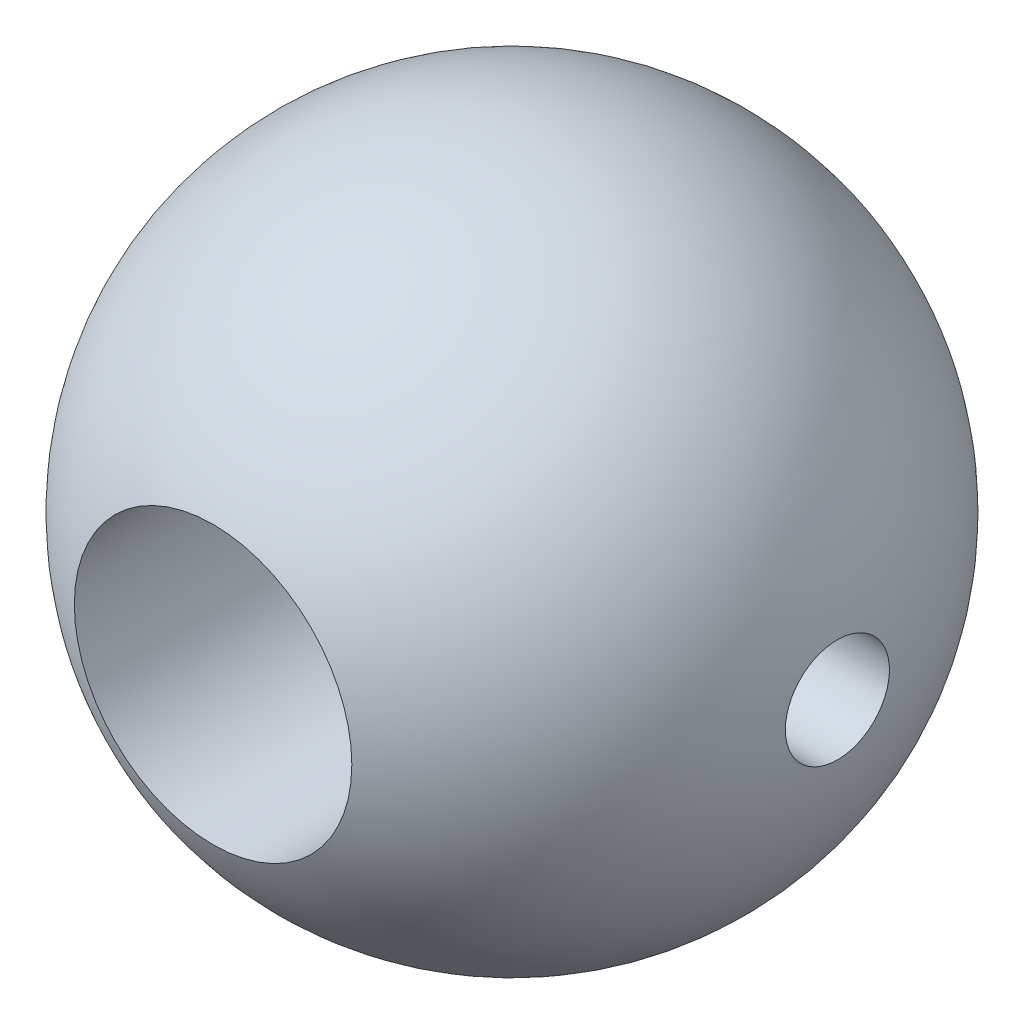
ISO-10303-21;
HEADER;
FILE_DESCRIPTION(('STEP AP214'),'2;1');
FILE_NAME('part.step','',(''),(''),'','','');
FILE_SCHEMA(('AUTOMOTIVE_DESIGN { 1 0 10303 214 1 1 1 1 }'));
ENDSEC;
DATA;
#1=APPLICATION_CONTEXT('core data for automotive mechanical design processes');
#2=APPLICATION_PROTOCOL_DEFINITION('international standard','automotive_design',2000,#1);
#3=PRODUCT_CONTEXT('',#1,'mechanical');
#4=PRODUCT('Part','Part','',(#3));
#5=PRODUCT_RELATED_PRODUCT_CATEGORY('part','',(#4));
#6=PRODUCT_DEFINITION_FORMATION('','',#4);
#7=PRODUCT_DEFINITION_CONTEXT('part definition',#1,'design');
#8=PRODUCT_DEFINITION('design','',#6,#7);
#9=PRODUCT_DEFINITION_SHAPE('','',#8);
#10=(LENGTH_UNIT() NAMED_UNIT(*) SI_UNIT(.MILLI.,.METRE.));
#11=(NAMED_UNIT(*) PLANE_ANGLE_UNIT() SI_UNIT($,.RADIAN.));
#12=(NAMED_UNIT(*) SI_UNIT($,.STERADIAN.) SOLID_ANGLE_UNIT());
#13=UNCERTAINTY_MEASURE_WITH_UNIT(LENGTH_MEASURE(1.E-05),#10,'distance_accuracy_value','');
#14=(GEOMETRIC_REPRESENTATION_CONTEXT(3) GLOBAL_UNCERTAINTY_ASSIGNED_CONTEXT((#13)) GLOBAL_UNIT_ASSIGNED_CONTEXT((#10,
#11,#12)) REPRESENTATION_CONTEXT('',''));
#15=CARTESIAN_POINT('',(0.,0.,0.));
#16=DIRECTION('',(0.,0.,1.));
#17=DIRECTION('',(1.,0.,0.));
#18=AXIS2_PLACEMENT_3D('',#15,#16,#17);
#19=CARTESIAN_POINT('',(0.,0.,0.));
#20=DIRECTION('',(0.,0.,-1.));
#21=DIRECTION('',(1.,0.,0.));
#22=AXIS2_PLACEMENT_3D('',#19,#20,#21);
#23=SPHERICAL_SURFACE('',#22,9.652);
#24=CARTESIAN_POINT('',(0.,0.,-8.75471347332396));
#25=DIRECTION('',(0.,0.,-1.));
#26=DIRECTION('',(-1.,0.,0.));
#27=AXIS2_PLACEMENT_3D('',#24,#25,#26);
#28=CIRCLE('',#27,4.064);
#29=CARTESIAN_POINT('',(-4.06399999999999,0.,-8.75471347332396));
#30=VERTEX_POINT('',#29);
#31=EDGE_CURVE('E55',#30,#30,#28,.T.);
#32=ORIENTED_EDGE('',*,*,#31,.F.);
#33=EDGE_LOOP('',(#32));
#34=FACE_BOUND('',#33,.T.);
#35=CARTESIAN_POINT('',(0.,0.,8.75471347332396));
#36=DIRECTION('',(0.,0.,-1.));
#37=DIRECTION('',(-1.,0.,0.));
#38=AXIS2_PLACEMENT_3D('',#35,#36,#37);
#39=CIRCLE('',#38,4.064);
#40=CARTESIAN_POINT('',(-4.06399999999999,0.,8.75471347332396));
#41=VERTEX_POINT('',#40);
#42=EDGE_CURVE('E10',#41,#41,#39,.T.);
#43=ORIENTED_EDGE('',*,*,#42,.T.);
#44=EDGE_LOOP('',(#43));
#45=FACE_BOUND('',#44,.T.);
#46=CARTESIAN_POINT('',(9.53092482396121,0.,0.));
#47=DIRECTION('',(-1.,0.,0.));
#48=DIRECTION('',(0.,0.,1.));
#49=AXIS2_PLACEMENT_3D('',#46,#47,#48);
#50=CIRCLE('',#49,1.524);
#51=CARTESIAN_POINT('',(9.53092482396121,0.,1.524));
#52=VERTEX_POINT('',#51);
#53=EDGE_CURVE('E95',#52,#52,#50,.F.);
#54=ORIENTED_EDGE('',*,*,#53,.F.);
#55=EDGE_LOOP('',(#54));
#56=FACE_BOUND('',#55,.T.);
#57=CARTESIAN_POINT('',(-9.53092482396121,0.,0.));
#58=DIRECTION('',(1.,0.,0.));
#59=DIRECTION('',(0.,0.,-1.));
#60=AXIS2_PLACEMENT_3D('',#57,#58,#59);
#61=CIRCLE('',#60,1.524);
#62=CARTESIAN_POINT('',(-9.53092482396121,0.,-1.524));
#63=VERTEX_POINT('',#62);
#64=EDGE_CURVE('E61',#63,#63,#61,.F.);
#65=ORIENTED_EDGE('',*,*,#64,.F.);
#66=EDGE_LOOP('',(#65));
#67=FACE_BOUND('',#66,.T.);
#68=ADVANCED_FACE('F43',(#34,#45,#56,#67),#23,.T.);
#69=CARTESIAN_POINT('',(0.,0.,0.));
#70=DIRECTION('',(0.,0.,-1.));
#71=DIRECTION('',(-1.,0.,0.));
#72=AXIS2_PLACEMENT_3D('',#69,#70,#71);
#73=CYLINDRICAL_SURFACE('',#72,4.064);
#74=ORIENTED_EDGE('',*,*,#42,.F.);
#75=EDGE_LOOP('',(#74));
#76=FACE_BOUND('',#75,.T.);
#77=ORIENTED_EDGE('',*,*,#31,.T.);
#78=EDGE_LOOP('',(#77));
#79=FACE_BOUND('',#78,.T.);
#80=CARTESIAN_POINT('',(4.064,0.,1.524));
#81=CARTESIAN_POINT('',(4.0640022093545,0.0825348198808585,1.52400294873996));
#82=CARTESIAN_POINT('',(4.06146385351715,0.165049445650301,1.51727432358764));
#83=CARTESIAN_POINT('',(4.05159155143038,0.327612707589999,1.49064655360575));
#84=CARTESIAN_POINT('',(4.04425829596297,0.407661697235418,1.4707493059219));
#85=CARTESIAN_POINT('',(4.02558333709809,0.562925757550732,1.41858695019989));
#86=CARTESIAN_POINT('',(4.01424936899031,0.638149827748874,1.38634569890906));
#87=CARTESIAN_POINT('',(3.98870188049599,0.782116099122817,1.31053188437593));
#88=CARTESIAN_POINT('',(3.97448758799188,0.850856555004725,1.26695628188714));
#89=CARTESIAN_POINT('',(3.94397226922756,0.982823959718558,1.16777766843196));
#90=CARTESIAN_POINT('',(3.92761218624903,1.04573906183361,1.11177805354445));
#91=CARTESIAN_POINT('',(3.89493984405268,1.16153612217953,0.990182998386616));
#92=CARTESIAN_POINT('',(3.87862760097193,1.2144150094095,0.924584631814719));
#93=CARTESIAN_POINT('',(3.84721070147615,1.31062173451441,0.782607052996419));
#94=CARTESIAN_POINT('',(3.83217571201952,1.35350903486892,0.705912363589448));
#95=CARTESIAN_POINT('',(3.80593458001232,1.4256374467543,0.545746072164781));
#96=CARTESIAN_POINT('',(3.79472690863495,1.45488400880619,0.462277192634416));
#97=CARTESIAN_POINT('',(3.77804083429322,1.4976696591383,0.294521391897668));
#98=CARTESIAN_POINT('',(3.77234627140451,1.51180386710055,0.210408480949591));
#99=CARTESIAN_POINT('',(3.76669870444594,1.52582429436154,0.0408267834782569));
#100=CARTESIAN_POINT('',(3.76674332917854,1.52571639791473,-0.0446414284964613));
#101=CARTESIAN_POINT('',(3.77238271818167,1.51171076483778,-0.209061837616364));
#102=CARTESIAN_POINT('',(3.7776451637306,1.49863869445148,-0.288097880540884));
#103=CARTESIAN_POINT('',(3.79257497068482,1.46044074554223,-0.442759744811802));
#104=CARTESIAN_POINT('',(3.80224299543645,1.43531305177871,-0.518385050719702));
#105=CARTESIAN_POINT('',(3.82509473425297,1.37326368549054,-0.665761500811884));
#106=CARTESIAN_POINT('',(3.83834150275976,1.33612787116894,-0.737412277899243));
#107=CARTESIAN_POINT('',(3.86683717501548,1.25126570942901,-0.873704869392427));
#108=CARTESIAN_POINT('',(3.88208676928472,1.20353570548559,-0.938344252360014));
#109=CARTESIAN_POINT('',(3.91412007480859,1.09506289258814,-1.06334932226929));
#110=CARTESIAN_POINT('',(3.93093801014961,1.03366111496427,-1.12313581900006));
#111=CARTESIAN_POINT('',(3.96333195814711,0.901509592272125,-1.23173537366509));
#112=CARTESIAN_POINT('',(3.97890777969407,0.830758413153322,-1.28054674507936));
#113=CARTESIAN_POINT('',(4.00737217126025,0.680439011984299,-1.36644928341552));
#114=CARTESIAN_POINT('',(4.0202154623177,0.600751365266235,-1.4033475425206));
#115=CARTESIAN_POINT('',(4.04143177820193,0.435698240132977,-1.46302232593836));
#116=CARTESIAN_POINT('',(4.04980678826957,0.3503353022193,-1.4858051224261));
#117=CARTESIAN_POINT('',(4.06079394319714,0.181229247039045,-1.51548875214261));
#118=CARTESIAN_POINT('',(4.06368878930097,0.0976412774752053,-1.52316952808463));
#119=CARTESIAN_POINT('',(4.06426307999328,-0.0696696348591039,-1.52470212092232));
#120=CARTESIAN_POINT('',(4.06194368089053,-0.153392543591106,-1.51855700384185));
#121=CARTESIAN_POINT('',(4.05253657129005,-0.315226241338848,-1.49320499701439));
#122=CARTESIAN_POINT('',(4.04563550497702,-0.393429061255452,-1.47450907156312));
#123=CARTESIAN_POINT('',(4.02794700725185,-0.545532823036535,-1.42525895029192));
#124=CARTESIAN_POINT('',(4.01715907038543,-0.619433203953094,-1.3947032121648));
#125=CARTESIAN_POINT('',(3.99236818398204,-0.763267729351917,-1.32162660496149));
#126=CARTESIAN_POINT('',(3.97828008212698,-0.83302153289472,-1.27878054710904));
#127=CARTESIAN_POINT('',(3.94844698309699,-0.964582995114251,-1.1827072071777));
#128=CARTESIAN_POINT('',(3.93270137521668,-1.02638770619478,-1.12947609253413));
#129=CARTESIAN_POINT('',(3.90015302762845,-1.14404729152445,-1.01050941192174));
#130=CARTESIAN_POINT('',(3.88334195647789,-1.19934892589546,-0.944227542302939));
#131=CARTESIAN_POINT('',(3.85144076798803,-1.29815386832414,-0.802994193137022));
#132=CARTESIAN_POINT('',(3.8363508052551,-1.34165611693151,-0.728041935949284));
#133=CARTESIAN_POINT('',(3.80966299099623,-1.41567177895302,-0.57097575743933));
#134=CARTESIAN_POINT('',(3.79807988493749,-1.44613056414069,-0.488833418154998));
#135=CARTESIAN_POINT('',(3.78006897417261,-1.49258409602359,-0.320030080093173));
#136=CARTESIAN_POINT('',(3.7736379803441,-1.50858779110424,-0.233371912022707));
#137=CARTESIAN_POINT('',(3.76708309109254,-1.52487728651405,-0.0639915819062279));
#138=CARTESIAN_POINT('',(3.76658067635714,-1.52610648799771,0.0186259538243559));
#139=CARTESIAN_POINT('',(3.77096947349217,-1.51522903091858,0.182824441336584));
#140=CARTESIAN_POINT('',(3.77586017393281,-1.50312363687725,0.264405490666329));
#141=CARTESIAN_POINT('',(3.79016911850799,-1.46665508680325,0.421687982344016));
#142=CARTESIAN_POINT('',(3.79944462742689,-1.44267731089588,0.49749287978527));
#143=CARTESIAN_POINT('',(3.8213949307061,-1.38348411928398,0.644047996630331));
#144=CARTESIAN_POINT('',(3.83407058427138,-1.34826586272064,0.714796932679264));
#145=CARTESIAN_POINT('',(3.86221959486428,-1.26544909153164,0.853264018332793));
#146=CARTESIAN_POINT('',(3.8778047761602,-1.21729838127858,0.920628889548708));
#147=CARTESIAN_POINT('',(3.90963146705292,-1.11083837501585,1.04662382594674));
#148=CARTESIAN_POINT('',(3.92587318398235,-1.05252585037013,1.10525110398334));
#149=CARTESIAN_POINT('',(3.95823871403639,-0.923625683133177,1.21534118711499));
#150=CARTESIAN_POINT('',(3.97430858579055,-0.8525445425204,1.26624461348963));
#151=CARTESIAN_POINT('',(4.00359386688343,-0.702272634772034,1.35536701776098));
#152=CARTESIAN_POINT('',(4.01680905401184,-0.623081237036071,1.39358500834015));
#153=CARTESIAN_POINT('',(4.03935481288387,-0.455167067314349,1.4573268583131));
#154=CARTESIAN_POINT('',(4.0484923567289,-0.366180036989956,1.48222925763553));
#155=CARTESIAN_POINT('',(4.0608122205446,-0.184785745344085,1.51556004727941));
#156=CARTESIAN_POINT('',(4.0639975270963,-0.092380223026697,1.52399669951112));
#157=CARTESIAN_POINT('',(4.064,0.,1.524));
#158=B_SPLINE_CURVE_WITH_KNOTS('',3,(#80,#81,#82,#83,#84,#85,#86,#87,#88,#89,#90,#91,#92,#93,
#94,#95,#96,#97,#98,#99,#100,#101,#102,#103,#104,#105,#106,#107,#108,#109,#110,#111,#112,#113,
#114,#115,#116,#117,#118,#119,#120,#121,#122,#123,#124,#125,#126,#127,#128,#129,#130,#131,#132,
#133,#134,#135,#136,#137,#138,#139,#140,#141,#142,#143,#144,#145,#146,#147,#148,#149,#150,#151,
#152,#153,#154,#155,#156,#157),.UNSPECIFIED.,.T.,.F.,(4,2,2,2,2,2,2,2,2,2,2,2,2,2,2,2,2,2,2,2,2,
2,2,2,2,2,2,2,2,2,2,2,2,2,2,2,2,2,4),(0.,0.247263718385529,0.494491822322947,0.74124451112099,
0.988063433683241,1.24433196480039,1.50067878604431,1.76679021293685,2.03279521661768,
2.28788848407572,2.54287635776982,2.78260398641891,3.02236772269558,3.2666676692121,
3.51105206596167,3.77186091789186,4.03270982031547,4.29759237290652,4.56235714094027,
4.813046199501,5.06367967084769,5.30468268930621,5.54571705946524,5.79383369409353,
6.04204206900185,6.30465103766948,6.56728357782863,6.83100555794839,7.09456416955811,
7.34119703695936,7.58780651814639,7.82688952705358,8.0660330084301,8.31771231434419,
8.56947173069015,8.83485486928503,9.10025865801983,9.37715691272554,9.65391619424865),.UNSPECIFIED.);
#159=CARTESIAN_POINT('',(4.064,0.,1.524));
#160=VERTEX_POINT('',#159);
#161=EDGE_CURVE('E64',#160,#160,#158,.T.);
#162=ORIENTED_EDGE('',*,*,#161,.F.);
#163=EDGE_LOOP('',(#162));
#164=FACE_BOUND('',#163,.T.);
#165=CARTESIAN_POINT('',(-4.06399999999999,0.,1.524));
#166=CARTESIAN_POINT('',(-4.06400220935449,-0.0825348198808585,1.52400294873996));
#167=CARTESIAN_POINT('',(-4.06146385351714,-0.165049445650301,1.51727432358764));
#168=CARTESIAN_POINT('',(-4.05159155143038,-0.327612707589999,1.49064655360575));
#169=CARTESIAN_POINT('',(-4.04425829596296,-0.407661697235418,1.4707493059219));
#170=CARTESIAN_POINT('',(-4.02558333709809,-0.562925757550732,1.41858695019989));
#171=CARTESIAN_POINT('',(-4.0142493689903,-0.638149827748874,1.38634569890906));
#172=CARTESIAN_POINT('',(-3.98870188049598,-0.782116099122817,1.31053188437593));
#173=CARTESIAN_POINT('',(-3.97448758799188,-0.850856555004725,1.26695628188714));
#174=CARTESIAN_POINT('',(-3.94397226922755,-0.982823959718558,1.16777766843196));
#175=CARTESIAN_POINT('',(-3.92761218624902,-1.04573906183361,1.11177805354445));
#176=CARTESIAN_POINT('',(-3.89493984405267,-1.16153612217953,0.990182998386616));
#177=CARTESIAN_POINT('',(-3.87862760097192,-1.2144150094095,0.924584631814719));
#178=CARTESIAN_POINT('',(-3.84721070147614,-1.31062173451441,0.782607052996419));
#179=CARTESIAN_POINT('',(-3.83217571201951,-1.35350903486892,0.705912363589448));
#180=CARTESIAN_POINT('',(-3.80593458001232,-1.4256374467543,0.545746072164781));
#181=CARTESIAN_POINT('',(-3.79472690863494,-1.45488400880619,0.462277192634416));
#182=CARTESIAN_POINT('',(-3.77804083429321,-1.4976696591383,0.294521391897668));
#183=CARTESIAN_POINT('',(-3.7723462714045,-1.51180386710055,0.210408480949591));
#184=CARTESIAN_POINT('',(-3.76669870444593,-1.52582429436154,0.0408267834782569));
#185=CARTESIAN_POINT('',(-3.76674332917853,-1.52571639791473,-0.0446414284964613));
#186=CARTESIAN_POINT('',(-3.77238271818167,-1.51171076483778,-0.209061837616364));
#187=CARTESIAN_POINT('',(-3.77764516373059,-1.49863869445148,-0.288097880540884));
#188=CARTESIAN_POINT('',(-3.79257497068481,-1.46044074554223,-0.442759744811802));
#189=CARTESIAN_POINT('',(-3.80224299543644,-1.43531305177871,-0.518385050719702));
#190=CARTESIAN_POINT('',(-3.82509473425296,-1.37326368549054,-0.665761500811884));
#191=CARTESIAN_POINT('',(-3.83834150275976,-1.33612787116894,-0.737412277899243));
#192=CARTESIAN_POINT('',(-3.86683717501548,-1.25126570942901,-0.873704869392427));
#193=CARTESIAN_POINT('',(-3.88208676928471,-1.20353570548559,-0.938344252360014));
#194=CARTESIAN_POINT('',(-3.91412007480858,-1.09506289258814,-1.06334932226929));
#195=CARTESIAN_POINT('',(-3.93093801014961,-1.03366111496427,-1.12313581900006));
#196=CARTESIAN_POINT('',(-3.9633319581471,-0.901509592272125,-1.23173537366509));
#197=CARTESIAN_POINT('',(-3.97890777969406,-0.830758413153322,-1.28054674507936));
#198=CARTESIAN_POINT('',(-4.00737217126024,-0.680439011984299,-1.36644928341552));
#199=CARTESIAN_POINT('',(-4.02021546231769,-0.600751365266235,-1.4033475425206));
#200=CARTESIAN_POINT('',(-4.04143177820193,-0.435698240132977,-1.46302232593836));
#201=CARTESIAN_POINT('',(-4.04980678826956,-0.3503353022193,-1.4858051224261));
#202=CARTESIAN_POINT('',(-4.06079394319713,-0.181229247039045,-1.51548875214261));
#203=CARTESIAN_POINT('',(-4.06368878930096,-0.0976412774752053,-1.52316952808463));
#204=CARTESIAN_POINT('',(-4.06426307999327,0.0696696348591039,-1.52470212092232));
#205=CARTESIAN_POINT('',(-4.06194368089052,0.153392543591106,-1.51855700384185));
#206=CARTESIAN_POINT('',(-4.05253657129005,0.315226241338848,-1.49320499701439));
#207=CARTESIAN_POINT('',(-4.04563550497701,0.393429061255452,-1.47450907156312));
#208=CARTESIAN_POINT('',(-4.02794700725184,0.545532823036535,-1.42525895029192));
#209=CARTESIAN_POINT('',(-4.01715907038542,0.619433203953094,-1.3947032121648));
#210=CARTESIAN_POINT('',(-3.99236818398204,0.763267729351917,-1.32162660496149));
#211=CARTESIAN_POINT('',(-3.97828008212697,0.83302153289472,-1.27878054710904));
#212=CARTESIAN_POINT('',(-3.94844698309698,0.964582995114251,-1.1827072071777));
#213=CARTESIAN_POINT('',(-3.93270137521667,1.02638770619478,-1.12947609253413));
#214=CARTESIAN_POINT('',(-3.90015302762845,1.14404729152445,-1.01050941192174));
#215=CARTESIAN_POINT('',(-3.88334195647788,1.19934892589546,-0.944227542302939));
#216=CARTESIAN_POINT('',(-3.85144076798803,1.29815386832414,-0.802994193137022));
#217=CARTESIAN_POINT('',(-3.83635080525509,1.34165611693151,-0.728041935949284));
#218=CARTESIAN_POINT('',(-3.80966299099622,1.41567177895302,-0.57097575743933));
#219=CARTESIAN_POINT('',(-3.79807988493749,1.44613056414069,-0.488833418154998));
#220=CARTESIAN_POINT('',(-3.7800689741726,1.49258409602359,-0.320030080093173));
#221=CARTESIAN_POINT('',(-3.7736379803441,1.50858779110424,-0.233371912022707));
#222=CARTESIAN_POINT('',(-3.76708309109254,1.52487728651405,-0.0639915819062279));
#223=CARTESIAN_POINT('',(-3.76658067635714,1.52610648799771,0.0186259538243559));
#224=CARTESIAN_POINT('',(-3.77096947349216,1.51522903091858,0.182824441336584));
#225=CARTESIAN_POINT('',(-3.7758601739328,1.50312363687725,0.264405490666329));
#226=CARTESIAN_POINT('',(-3.79016911850799,1.46665508680325,0.421687982344016));
#227=CARTESIAN_POINT('',(-3.79944462742689,1.44267731089588,0.49749287978527));
#228=CARTESIAN_POINT('',(-3.82139493070609,1.38348411928398,0.644047996630331));
#229=CARTESIAN_POINT('',(-3.83407058427137,1.34826586272064,0.714796932679264));
#230=CARTESIAN_POINT('',(-3.86221959486427,1.26544909153164,0.853264018332793));
#231=CARTESIAN_POINT('',(-3.87780477616019,1.21729838127858,0.920628889548708));
#232=CARTESIAN_POINT('',(-3.90963146705291,1.11083837501585,1.04662382594674));
#233=CARTESIAN_POINT('',(-3.92587318398235,1.05252585037013,1.10525110398334));
#234=CARTESIAN_POINT('',(-3.95823871403638,0.923625683133177,1.21534118711499));
#235=CARTESIAN_POINT('',(-3.97430858579054,0.8525445425204,1.26624461348963));
#236=CARTESIAN_POINT('',(-4.00359386688342,0.702272634772034,1.35536701776098));
#237=CARTESIAN_POINT('',(-4.01680905401183,0.623081237036071,1.39358500834015));
#238=CARTESIAN_POINT('',(-4.03935481288386,0.455167067314349,1.4573268583131));
#239=CARTESIAN_POINT('',(-4.04849235672889,0.366180036989956,1.48222925763553));
#240=CARTESIAN_POINT('',(-4.06081222054459,0.184785745344085,1.51556004727941));
#241=CARTESIAN_POINT('',(-4.0639975270963,0.092380223026697,1.52399669951112));
#242=CARTESIAN_POINT('',(-4.06399999999999,0.,1.524));
#243=B_SPLINE_CURVE_WITH_KNOTS('',3,(#165,#166,#167,#168,#169,#170,#171,#172,#173,#174,#175,
#176,#177,#178,#179,#180,#181,#182,#183,#184,#185,#186,#187,#188,#189,#190,#191,#192,#193,#194,
#195,#196,#197,#198,#199,#200,#201,#202,#203,#204,#205,#206,#207,#208,#209,#210,#211,#212,#213,
#214,#215,#216,#217,#218,#219,#220,#221,#222,#223,#224,#225,#226,#227,#228,#229,#230,#231,#232,
#233,#234,#235,#236,#237,#238,#239,#240,#241,#242),.UNSPECIFIED.,.T.,.F.,(4,2,2,2,2,2,2,2,2,2,2,
2,2,2,2,2,2,2,2,2,2,2,2,2,2,2,2,2,2,2,2,2,2,2,2,2,2,2,4),(0.,0.247263718385529,
0.494491822322947,0.74124451112099,0.988063433683241,1.24433196480039,1.50067878604431,
1.76679021293685,2.03279521661768,2.28788848407572,2.54287635776982,2.78260398641891,
3.02236772269558,3.2666676692121,3.51105206596167,3.77186091789186,4.03270982031547,
4.29759237290652,4.56235714094027,4.813046199501,5.06367967084769,5.30468268930621,
5.54571705946524,5.79383369409353,6.04204206900185,6.30465103766948,6.56728357782863,
6.83100555794839,7.09456416955811,7.34119703695936,7.58780651814639,7.82688952705358,
8.0660330084301,8.31771231434419,8.56947173069015,8.83485486928503,9.10025865801983,
9.37715691272554,9.65391619424865),.UNSPECIFIED.);
#244=CARTESIAN_POINT('',(-4.06399999999999,0.,1.524));
#245=VERTEX_POINT('',#244);
#246=EDGE_CURVE('E46',#245,#245,#243,.T.);
#247=ORIENTED_EDGE('',*,*,#246,.F.);
#248=EDGE_LOOP('',(#247));
#249=FACE_BOUND('',#248,.T.);
#250=ADVANCED_FACE('F70',(#76,#79,#164,#249),#73,.F.);
#251=CARTESIAN_POINT('',(-11.8879811945785,0.,0.));
#252=DIRECTION('',(-1.,0.,0.));
#253=DIRECTION('',(0.,0.,1.));
#254=AXIS2_PLACEMENT_3D('',#251,#252,#253);
#255=CYLINDRICAL_SURFACE('',#254,1.524);
#256=ORIENTED_EDGE('',*,*,#161,.T.);
#257=EDGE_LOOP('',(#256));
#258=FACE_BOUND('',#257,.T.);
#259=ORIENTED_EDGE('',*,*,#53,.T.);
#260=EDGE_LOOP('',(#259));
#261=FACE_BOUND('',#260,.T.);
#262=ADVANCED_FACE('F75',(#258,#261),#255,.F.);
#263=ORIENTED_EDGE('',*,*,#246,.T.);
#264=EDGE_LOOP('',(#263));
#265=FACE_BOUND('',#264,.T.);
#266=ORIENTED_EDGE('',*,*,#64,.T.);
#267=EDGE_LOOP('',(#266));
#268=FACE_BOUND('',#267,.T.);
#269=ADVANCED_FACE('F72',(#265,#268),#255,.F.);
#270=CLOSED_SHELL('',(#68,#250,#262,#269));
#271=MANIFOLD_SOLID_BREP('B2',#270);
#272=ADVANCED_BREP_SHAPE_REPRESENTATION('',(#18,#271),#14);
#273=SHAPE_DEFINITION_REPRESENTATION(#9,#272);
ENDSEC;
END-ISO-10303-21;
